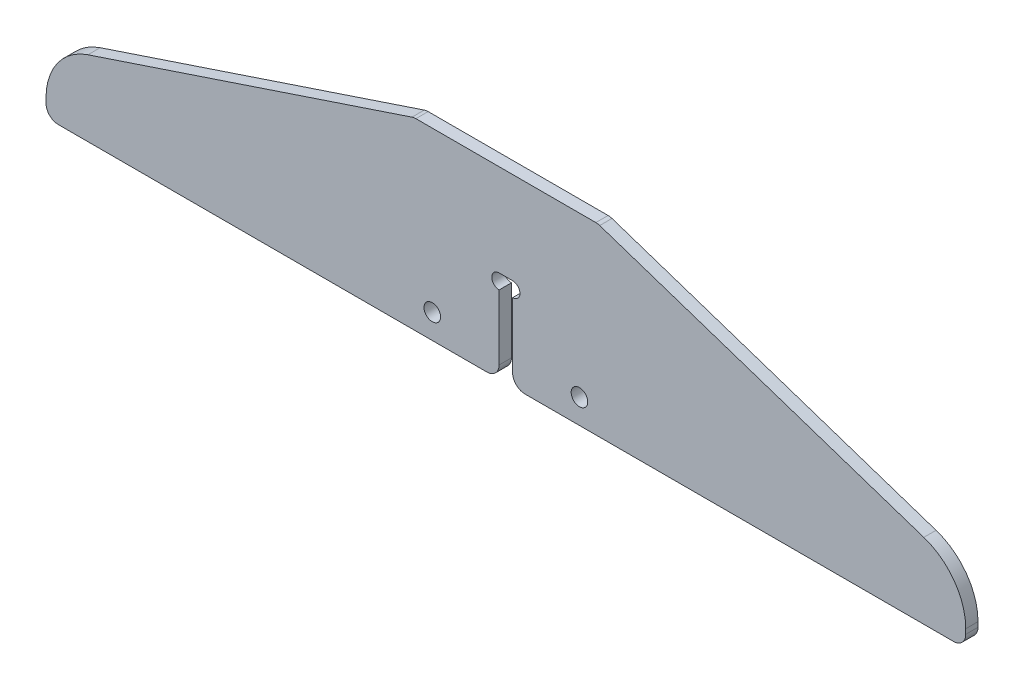
ISO-10303-21;
HEADER;
FILE_DESCRIPTION(('STEP AP214'),'2;1');
FILE_NAME('part.step','',(''),(''),'','','');
FILE_SCHEMA(('AUTOMOTIVE_DESIGN { 1 0 10303 214 1 1 1 1 }'));
ENDSEC;
DATA;
#1=APPLICATION_CONTEXT('core data for automotive mechanical design processes');
#2=APPLICATION_PROTOCOL_DEFINITION('international standard','automotive_design',2000,#1);
#3=PRODUCT_CONTEXT('',#1,'mechanical');
#4=PRODUCT('Part','Part','',(#3));
#5=PRODUCT_RELATED_PRODUCT_CATEGORY('part','',(#4));
#6=PRODUCT_DEFINITION_FORMATION('','',#4);
#7=PRODUCT_DEFINITION_CONTEXT('part definition',#1,'design');
#8=PRODUCT_DEFINITION('design','',#6,#7);
#9=PRODUCT_DEFINITION_SHAPE('','',#8);
#10=(LENGTH_UNIT() NAMED_UNIT(*) SI_UNIT(.MILLI.,.METRE.));
#11=(NAMED_UNIT(*) PLANE_ANGLE_UNIT() SI_UNIT($,.RADIAN.));
#12=(NAMED_UNIT(*) SI_UNIT($,.STERADIAN.) SOLID_ANGLE_UNIT());
#13=UNCERTAINTY_MEASURE_WITH_UNIT(LENGTH_MEASURE(1.E-05),#10,'distance_accuracy_value','');
#14=(GEOMETRIC_REPRESENTATION_CONTEXT(3) GLOBAL_UNCERTAINTY_ASSIGNED_CONTEXT((#13)) GLOBAL_UNIT_ASSIGNED_CONTEXT((#10,
#11,#12)) REPRESENTATION_CONTEXT('',''));
#15=CARTESIAN_POINT('',(0.,0.,0.));
#16=DIRECTION('',(0.,0.,1.));
#17=DIRECTION('',(1.,0.,0.));
#18=AXIS2_PLACEMENT_3D('',#15,#16,#17);
#19=CARTESIAN_POINT('',(-75.,0.,1.));
#20=DIRECTION('',(0.,1.,0.));
#21=DIRECTION('',(-1.,0.,0.));
#22=AXIS2_PLACEMENT_3D('',#19,#20,#21);
#23=PLANE('',#22);
#24=DIRECTION('',(1.,0.,0.));
#25=VECTOR('',#24,1.);
#26=CARTESIAN_POINT('',(-75.,0.,-1.));
#27=LINE('',#26,#25);
#28=CARTESIAN_POINT('',(-73.,0.,-1.));
#29=VERTEX_POINT('',#28);
#30=CARTESIAN_POINT('',(-3.10000000000001,0.,-1.));
#31=VERTEX_POINT('',#30);
#32=EDGE_CURVE('E260',#29,#31,#27,.T.);
#33=ORIENTED_EDGE('',*,*,#32,.T.);
#34=DIRECTION('',(0.,0.,1.));
#35=VECTOR('',#34,1.);
#36=CARTESIAN_POINT('',(-3.1,0.,1.));
#37=LINE('',#36,#35);
#38=CARTESIAN_POINT('',(-3.10000000000001,0.,1.));
#39=VERTEX_POINT('',#38);
#40=EDGE_CURVE('E322',#31,#39,#37,.T.);
#41=ORIENTED_EDGE('',*,*,#40,.T.);
#42=DIRECTION('',(1.,0.,0.));
#43=VECTOR('',#42,1.);
#44=CARTESIAN_POINT('',(-75.,0.,1.));
#45=LINE('',#44,#43);
#46=CARTESIAN_POINT('',(-73.,0.,1.));
#47=VERTEX_POINT('',#46);
#48=EDGE_CURVE('E245',#47,#39,#45,.T.);
#49=ORIENTED_EDGE('',*,*,#48,.F.);
#50=DIRECTION('',(0.,0.,-1.));
#51=VECTOR('',#50,1.);
#52=CARTESIAN_POINT('',(-73.,0.,1.));
#53=LINE('',#52,#51);
#54=EDGE_CURVE('E319',#47,#29,#53,.T.);
#55=ORIENTED_EDGE('',*,*,#54,.T.);
#56=EDGE_LOOP('',(#33,#41,#49,#55));
#57=FACE_BOUND('',#56,.T.);
#58=ADVANCED_FACE('F45',(#57),#23,.F.);
#59=CARTESIAN_POINT('',(-15.,30.,1.));
#60=DIRECTION('',(0.316227766016838,-0.948683298050514,0.));
#61=DIRECTION('',(0.948683298050514,0.316227766016838,0.));
#62=AXIS2_PLACEMENT_3D('',#59,#60,#61);
#63=PLANE('',#62);
#64=DIRECTION('',(-0.948683298050514,-0.316227766016838,0.));
#65=VECTOR('',#64,1.);
#66=CARTESIAN_POINT('',(-15.,30.,1.));
#67=LINE('',#66,#65);
#68=CARTESIAN_POINT('',(-15.3079002116969,29.897366596101,1.));
#69=VERTEX_POINT('',#68);
#70=CARTESIAN_POINT('',(-68.1622776601684,12.2792407799439,1.));
#71=VERTEX_POINT('',#70);
#72=EDGE_CURVE('E236',#69,#71,#67,.T.);
#73=ORIENTED_EDGE('',*,*,#72,.F.);
#74=DIRECTION('',(0.,0.,-1.));
#75=VECTOR('',#74,1.);
#76=CARTESIAN_POINT('',(-15.3079002116969,29.897366596101,1.));
#77=LINE('',#76,#75);
#78=CARTESIAN_POINT('',(-15.3079002116969,29.897366596101,-1.));
#79=VERTEX_POINT('',#78);
#80=EDGE_CURVE('E332',#69,#79,#77,.T.);
#81=ORIENTED_EDGE('',*,*,#80,.T.);
#82=DIRECTION('',(-0.948683298050514,-0.316227766016838,0.));
#83=VECTOR('',#82,1.);
#84=CARTESIAN_POINT('',(-15.,30.,-1.));
#85=LINE('',#84,#83);
#86=CARTESIAN_POINT('',(-68.1622776601684,12.2792407799439,-1.));
#87=VERTEX_POINT('',#86);
#88=EDGE_CURVE('E231',#79,#87,#85,.T.);
#89=ORIENTED_EDGE('',*,*,#88,.T.);
#90=DIRECTION('',(0.,0.,-1.));
#91=VECTOR('',#90,1.);
#92=CARTESIAN_POINT('',(-68.1622776601684,12.2792407799439,1.));
#93=LINE('',#92,#91);
#94=EDGE_CURVE('E287',#87,#71,#93,.F.);
#95=ORIENTED_EDGE('',*,*,#94,.T.);
#96=EDGE_LOOP('',(#73,#81,#89,#95));
#97=FACE_BOUND('',#96,.T.);
#98=ADVANCED_FACE('F367',(#97),#63,.F.);
#99=CARTESIAN_POINT('',(-75.,9.99999999999998,1.));
#100=DIRECTION('',(1.,0.,0.));
#101=DIRECTION('',(0.,1.,0.));
#102=AXIS2_PLACEMENT_3D('',#99,#100,#101);
#103=PLANE('',#102);
#104=DIRECTION('',(0.,-1.,0.));
#105=VECTOR('',#104,1.);
#106=CARTESIAN_POINT('',(-75.,9.99999999999998,-1.));
#107=LINE('',#106,#105);
#108=CARTESIAN_POINT('',(-75.,2.79240779943871,-1.));
#109=VERTEX_POINT('',#108);
#110=CARTESIAN_POINT('',(-75.,1.99999999999998,-1.));
#111=VERTEX_POINT('',#110);
#112=EDGE_CURVE('E256',#109,#111,#107,.T.);
#113=ORIENTED_EDGE('',*,*,#112,.T.);
#114=DIRECTION('',(0.,0.,-1.));
#115=VECTOR('',#114,1.);
#116=CARTESIAN_POINT('',(-75.,1.99999999999998,1.));
#117=LINE('',#116,#115);
#118=CARTESIAN_POINT('',(-75.,1.99999999999998,1.));
#119=VERTEX_POINT('',#118);
#120=EDGE_CURVE('E11',#111,#119,#117,.F.);
#121=ORIENTED_EDGE('',*,*,#120,.T.);
#122=DIRECTION('',(0.,-1.,0.));
#123=VECTOR('',#122,1.);
#124=CARTESIAN_POINT('',(-75.,9.99999999999998,1.));
#125=LINE('',#124,#123);
#126=CARTESIAN_POINT('',(-75.,2.79240779943871,1.));
#127=VERTEX_POINT('',#126);
#128=EDGE_CURVE('E238',#127,#119,#125,.T.);
#129=ORIENTED_EDGE('',*,*,#128,.F.);
#130=DIRECTION('',(0.,0.,-1.));
#131=VECTOR('',#130,1.);
#132=CARTESIAN_POINT('',(-75.,2.79240779943871,1.));
#133=LINE('',#132,#131);
#134=EDGE_CURVE('E284',#127,#109,#133,.T.);
#135=ORIENTED_EDGE('',*,*,#134,.T.);
#136=EDGE_LOOP('',(#113,#121,#129,#135));
#137=FACE_BOUND('',#136,.T.);
#138=ADVANCED_FACE('F376',(#137),#103,.F.);
#139=CARTESIAN_POINT('',(3.10000000000001,0.,1.));
#140=VERTEX_POINT('',#139);
#141=CARTESIAN_POINT('',(73.,0.,1.));
#142=VERTEX_POINT('',#141);
#143=EDGE_CURVE('E242',#140,#142,#45,.T.);
#144=ORIENTED_EDGE('',*,*,#143,.F.);
#145=DIRECTION('',(0.,0.,1.));
#146=VECTOR('',#145,1.);
#147=CARTESIAN_POINT('',(3.10000000000001,0.,1.));
#148=LINE('',#147,#146);
#149=CARTESIAN_POINT('',(3.10000000000001,0.,-1.));
#150=VERTEX_POINT('',#149);
#151=EDGE_CURVE('E307',#140,#150,#148,.F.);
#152=ORIENTED_EDGE('',*,*,#151,.T.);
#153=CARTESIAN_POINT('',(73.,0.,-1.));
#154=VERTEX_POINT('',#153);
#155=EDGE_CURVE('E259',#150,#154,#27,.T.);
#156=ORIENTED_EDGE('',*,*,#155,.T.);
#157=DIRECTION('',(0.,0.,-1.));
#158=VECTOR('',#157,1.);
#159=CARTESIAN_POINT('',(73.,0.,1.));
#160=LINE('',#159,#158);
#161=EDGE_CURVE('E305',#154,#142,#160,.F.);
#162=ORIENTED_EDGE('',*,*,#161,.T.);
#163=EDGE_LOOP('',(#144,#152,#156,#162));
#164=FACE_BOUND('',#163,.T.);
#165=ADVANCED_FACE('F405',(#164),#23,.F.);
#166=CARTESIAN_POINT('',(75.,10.,1.));
#167=DIRECTION('',(-1.,0.,0.));
#168=DIRECTION('',(0.,-1.,0.));
#169=AXIS2_PLACEMENT_3D('',#166,#167,#168);
#170=PLANE('',#169);
#171=DIRECTION('',(0.,1.,0.));
#172=VECTOR('',#171,1.);
#173=CARTESIAN_POINT('',(75.,10.,1.));
#174=LINE('',#173,#172);
#175=CARTESIAN_POINT('',(75.,2.,1.));
#176=VERTEX_POINT('',#175);
#177=CARTESIAN_POINT('',(75.,2.79240779943872,1.));
#178=VERTEX_POINT('',#177);
#179=EDGE_CURVE('E246',#176,#178,#174,.T.);
#180=ORIENTED_EDGE('',*,*,#179,.F.);
#181=DIRECTION('',(0.,0.,-1.));
#182=VECTOR('',#181,1.);
#183=CARTESIAN_POINT('',(75.,2.,1.));
#184=LINE('',#183,#182);
#185=CARTESIAN_POINT('',(75.,2.,-1.));
#186=VERTEX_POINT('',#185);
#187=EDGE_CURVE('E53',#176,#186,#184,.T.);
#188=ORIENTED_EDGE('',*,*,#187,.T.);
#189=DIRECTION('',(0.,1.,0.));
#190=VECTOR('',#189,1.);
#191=CARTESIAN_POINT('',(75.,10.,-1.));
#192=LINE('',#191,#190);
#193=CARTESIAN_POINT('',(75.,2.79240779943872,-1.));
#194=VERTEX_POINT('',#193);
#195=EDGE_CURVE('E263',#186,#194,#192,.T.);
#196=ORIENTED_EDGE('',*,*,#195,.T.);
#197=DIRECTION('',(0.,0.,-1.));
#198=VECTOR('',#197,1.);
#199=CARTESIAN_POINT('',(75.,2.79240779943872,1.));
#200=LINE('',#199,#198);
#201=EDGE_CURVE('E277',#194,#178,#200,.F.);
#202=ORIENTED_EDGE('',*,*,#201,.T.);
#203=EDGE_LOOP('',(#180,#188,#196,#202));
#204=FACE_BOUND('',#203,.T.);
#205=ADVANCED_FACE('F339',(#204),#170,.F.);
#206=CARTESIAN_POINT('',(15.,30.,1.));
#207=DIRECTION('',(-0.316227766016838,-0.948683298050514,0.));
#208=DIRECTION('',(0.948683298050514,-0.316227766016838,0.));
#209=AXIS2_PLACEMENT_3D('',#206,#207,#208);
#210=PLANE('',#209);
#211=DIRECTION('',(-0.948683298050514,0.316227766016838,0.));
#212=VECTOR('',#211,1.);
#213=CARTESIAN_POINT('',(15.,30.,-1.));
#214=LINE('',#213,#212);
#215=CARTESIAN_POINT('',(68.1622776601684,12.2792407799439,-1.));
#216=VERTEX_POINT('',#215);
#217=CARTESIAN_POINT('',(15.3079002116969,29.897366596101,-1.));
#218=VERTEX_POINT('',#217);
#219=EDGE_CURVE('E265',#216,#218,#214,.T.);
#220=ORIENTED_EDGE('',*,*,#219,.T.);
#221=DIRECTION('',(0.,0.,-1.));
#222=VECTOR('',#221,1.);
#223=CARTESIAN_POINT('',(15.3079002116969,29.897366596101,1.));
#224=LINE('',#223,#222);
#225=CARTESIAN_POINT('',(15.3079002116969,29.897366596101,1.));
#226=VERTEX_POINT('',#225);
#227=EDGE_CURVE('E330',#218,#226,#224,.F.);
#228=ORIENTED_EDGE('',*,*,#227,.T.);
#229=DIRECTION('',(-0.948683298050514,0.316227766016838,0.));
#230=VECTOR('',#229,1.);
#231=CARTESIAN_POINT('',(15.,30.,1.));
#232=LINE('',#231,#230);
#233=CARTESIAN_POINT('',(68.1622776601684,12.2792407799439,1.));
#234=VERTEX_POINT('',#233);
#235=EDGE_CURVE('E248',#234,#226,#232,.T.);
#236=ORIENTED_EDGE('',*,*,#235,.F.);
#237=DIRECTION('',(0.,0.,-1.));
#238=VECTOR('',#237,1.);
#239=CARTESIAN_POINT('',(68.1622776601684,12.2792407799439,1.));
#240=LINE('',#239,#238);
#241=EDGE_CURVE('E254',#234,#216,#240,.T.);
#242=ORIENTED_EDGE('',*,*,#241,.T.);
#243=EDGE_LOOP('',(#220,#228,#236,#242));
#244=FACE_BOUND('',#243,.T.);
#245=ADVANCED_FACE('F355',(#244),#210,.F.);
#246=CARTESIAN_POINT('',(15.,30.,1.));
#247=DIRECTION('',(0.,-1.,0.));
#248=DIRECTION('',(1.,0.,0.));
#249=AXIS2_PLACEMENT_3D('',#246,#247,#248);
#250=PLANE('',#249);
#251=DIRECTION('',(-1.,0.,0.));
#252=VECTOR('',#251,1.);
#253=CARTESIAN_POINT('',(15.,30.,1.));
#254=LINE('',#253,#252);
#255=CARTESIAN_POINT('',(14.6754446796632,30.,1.));
#256=VERTEX_POINT('',#255);
#257=CARTESIAN_POINT('',(-14.6754446796632,30.,1.));
#258=VERTEX_POINT('',#257);
#259=EDGE_CURVE('E251',#256,#258,#254,.T.);
#260=ORIENTED_EDGE('',*,*,#259,.F.);
#261=DIRECTION('',(0.,0.,-1.));
#262=VECTOR('',#261,1.);
#263=CARTESIAN_POINT('',(14.6754446796632,30.,1.));
#264=LINE('',#263,#262);
#265=CARTESIAN_POINT('',(14.6754446796632,30.,-1.));
#266=VERTEX_POINT('',#265);
#267=EDGE_CURVE('E328',#256,#266,#264,.T.);
#268=ORIENTED_EDGE('',*,*,#267,.T.);
#269=DIRECTION('',(-1.,0.,0.));
#270=VECTOR('',#269,1.);
#271=CARTESIAN_POINT('',(15.,30.,-1.));
#272=LINE('',#271,#270);
#273=CARTESIAN_POINT('',(-14.6754446796632,30.,-1.));
#274=VERTEX_POINT('',#273);
#275=EDGE_CURVE('E239',#266,#274,#272,.T.);
#276=ORIENTED_EDGE('',*,*,#275,.T.);
#277=DIRECTION('',(0.,0.,-1.));
#278=VECTOR('',#277,1.);
#279=CARTESIAN_POINT('',(-14.6754446796632,30.,1.));
#280=LINE('',#279,#278);
#281=EDGE_CURVE('E326',#274,#258,#280,.F.);
#282=ORIENTED_EDGE('',*,*,#281,.T.);
#283=EDGE_LOOP('',(#260,#268,#276,#282));
#284=FACE_BOUND('',#283,.T.);
#285=ADVANCED_FACE('F360',(#284),#250,.F.);
#286=CARTESIAN_POINT('',(0.,0.,1.));
#287=DIRECTION('',(0.,0.,1.));
#288=DIRECTION('',(1.,0.,0.));
#289=AXIS2_PLACEMENT_3D('',#286,#287,#288);
#290=PLANE('',#289);
#291=CARTESIAN_POINT('',(-12.,3.99999999999998,1.));
#292=DIRECTION('',(0.,0.,1.));
#293=DIRECTION('',(1.,0.,0.));
#294=AXIS2_PLACEMENT_3D('',#291,#292,#293);
#295=CIRCLE('',#294,1.35);
#296=CARTESIAN_POINT('',(-10.65,3.99999999999998,1.));
#297=VERTEX_POINT('',#296);
#298=EDGE_CURVE('E667',#297,#297,#295,.T.);
#299=ORIENTED_EDGE('',*,*,#298,.F.);
#300=EDGE_LOOP('',(#299));
#301=FACE_BOUND('',#300,.T.);
#302=CARTESIAN_POINT('',(12.,3.99999999999999,1.));
#303=DIRECTION('',(0.,0.,1.));
#304=DIRECTION('',(-1.,0.,0.));
#305=AXIS2_PLACEMENT_3D('',#302,#303,#304);
#306=CIRCLE('',#305,1.35);
#307=CARTESIAN_POINT('',(10.65,3.99999999999999,1.));
#308=VERTEX_POINT('',#307);
#309=EDGE_CURVE('E670',#308,#308,#306,.T.);
#310=ORIENTED_EDGE('',*,*,#309,.F.);
#311=EDGE_LOOP('',(#310));
#312=FACE_BOUND('',#311,.T.);
#313=DIRECTION('',(0.,1.,0.));
#314=VECTOR('',#313,1.);
#315=CARTESIAN_POINT('',(1.1,0.,1.));
#316=LINE('',#315,#314);
#317=CARTESIAN_POINT('',(1.1,1.99999999999999,1.));
#318=VERTEX_POINT('',#317);
#319=CARTESIAN_POINT('',(1.1,12.6,1.));
#320=VERTEX_POINT('',#319);
#321=EDGE_CURVE('E225',#318,#320,#316,.T.);
#322=ORIENTED_EDGE('',*,*,#321,.F.);
#323=CARTESIAN_POINT('',(3.1,1.99999999999999,1.));
#324=DIRECTION('',(0.,0.,1.));
#325=DIRECTION('',(1.,0.,0.));
#326=AXIS2_PLACEMENT_3D('',#323,#324,#325);
#327=CIRCLE('',#326,2.);
#328=EDGE_CURVE('E303',#318,#140,#327,.T.);
#329=ORIENTED_EDGE('',*,*,#328,.T.);
#330=ORIENTED_EDGE('',*,*,#143,.T.);
#331=CARTESIAN_POINT('',(73.,2.,1.));
#332=DIRECTION('',(0.,0.,1.));
#333=DIRECTION('',(1.,0.,0.));
#334=AXIS2_PLACEMENT_3D('',#331,#332,#333);
#335=CIRCLE('',#334,2.);
#336=EDGE_CURVE('E295',#142,#176,#335,.T.);
#337=ORIENTED_EDGE('',*,*,#336,.T.);
#338=ORIENTED_EDGE('',*,*,#179,.T.);
#339=CARTESIAN_POINT('',(65.,2.79240779943874,1.));
#340=DIRECTION('',(0.,0.,1.));
#341=DIRECTION('',(1.,0.,0.));
#342=AXIS2_PLACEMENT_3D('',#339,#340,#341);
#343=CIRCLE('',#342,10.);
#344=EDGE_CURVE('E282',#178,#234,#343,.T.);
#345=ORIENTED_EDGE('',*,*,#344,.T.);
#346=ORIENTED_EDGE('',*,*,#235,.T.);
#347=CARTESIAN_POINT('',(14.6754446796632,28.,1.));
#348=DIRECTION('',(0.,0.,1.));
#349=DIRECTION('',(1.,0.,0.));
#350=AXIS2_PLACEMENT_3D('',#347,#348,#349);
#351=CIRCLE('',#350,2.);
#352=EDGE_CURVE('E299',#226,#256,#351,.T.);
#353=ORIENTED_EDGE('',*,*,#352,.T.);
#354=ORIENTED_EDGE('',*,*,#259,.T.);
#355=CARTESIAN_POINT('',(-14.6754446796633,28.,1.));
#356=DIRECTION('',(0.,0.,1.));
#357=DIRECTION('',(1.,0.,0.));
#358=AXIS2_PLACEMENT_3D('',#355,#356,#357);
#359=CIRCLE('',#358,2.);
#360=EDGE_CURVE('E297',#258,#69,#359,.T.);
#361=ORIENTED_EDGE('',*,*,#360,.T.);
#362=ORIENTED_EDGE('',*,*,#72,.T.);
#363=CARTESIAN_POINT('',(-65.,2.79240779943872,1.));
#364=DIRECTION('',(0.,0.,1.));
#365=DIRECTION('',(1.,0.,0.));
#366=AXIS2_PLACEMENT_3D('',#363,#364,#365);
#367=CIRCLE('',#366,10.);
#368=EDGE_CURVE('E280',#71,#127,#367,.T.);
#369=ORIENTED_EDGE('',*,*,#368,.T.);
#370=ORIENTED_EDGE('',*,*,#128,.T.);
#371=CARTESIAN_POINT('',(-73.,1.99999999999998,1.));
#372=DIRECTION('',(0.,0.,1.));
#373=DIRECTION('',(1.,0.,0.));
#374=AXIS2_PLACEMENT_3D('',#371,#372,#373);
#375=CIRCLE('',#374,2.);
#376=EDGE_CURVE('E293',#119,#47,#375,.T.);
#377=ORIENTED_EDGE('',*,*,#376,.T.);
#378=ORIENTED_EDGE('',*,*,#48,.T.);
#379=CARTESIAN_POINT('',(-3.10000000000001,1.99999999999999,1.));
#380=DIRECTION('',(0.,0.,1.));
#381=DIRECTION('',(1.,0.,0.));
#382=AXIS2_PLACEMENT_3D('',#379,#380,#381);
#383=CIRCLE('',#382,2.);
#384=CARTESIAN_POINT('',(-1.1,1.99999999999999,1.));
#385=VERTEX_POINT('',#384);
#386=EDGE_CURVE('E301',#39,#385,#383,.T.);
#387=ORIENTED_EDGE('',*,*,#386,.T.);
#388=DIRECTION('',(0.,1.,0.));
#389=VECTOR('',#388,1.);
#390=CARTESIAN_POINT('',(-1.1,0.,1.));
#391=LINE('',#390,#389);
#392=CARTESIAN_POINT('',(-1.1,12.6,1.));
#393=VERTEX_POINT('',#392);
#394=EDGE_CURVE('E222',#385,#393,#391,.T.);
#395=ORIENTED_EDGE('',*,*,#394,.T.);
#396=CARTESIAN_POINT('',(-1.1,13.8,1.));
#397=DIRECTION('',(0.,0.,1.));
#398=DIRECTION('',(1.,0.,0.));
#399=AXIS2_PLACEMENT_3D('',#396,#397,#398);
#400=CIRCLE('',#399,1.2);
#401=CARTESIAN_POINT('',(-1.1,15.,1.));
#402=VERTEX_POINT('',#401);
#403=EDGE_CURVE('E201',#402,#393,#400,.T.);
#404=ORIENTED_EDGE('',*,*,#403,.F.);
#405=DIRECTION('',(1.,0.,0.));
#406=VECTOR('',#405,1.);
#407=CARTESIAN_POINT('',(0.,15.,1.));
#408=LINE('',#407,#406);
#409=CARTESIAN_POINT('',(1.1,15.,1.));
#410=VERTEX_POINT('',#409);
#411=EDGE_CURVE('E208',#402,#410,#408,.T.);
#412=ORIENTED_EDGE('',*,*,#411,.T.);
#413=CARTESIAN_POINT('',(1.1,13.8,1.));
#414=DIRECTION('',(0.,0.,1.));
#415=DIRECTION('',(1.,0.,0.));
#416=AXIS2_PLACEMENT_3D('',#413,#414,#415);
#417=CIRCLE('',#416,1.2);
#418=EDGE_CURVE('E211',#320,#410,#417,.T.);
#419=ORIENTED_EDGE('',*,*,#418,.F.);
#420=EDGE_LOOP('',(#322,#329,#330,#337,#338,#345,#346,#353,#354,#361,#362,#369,#370,#377,#378,
#387,#395,#404,#412,#419));
#421=FACE_BOUND('',#420,.T.);
#422=ADVANCED_FACE('F352',(#301,#312,#421),#290,.T.);
#423=CARTESIAN_POINT('',(0.,0.,-1.));
#424=DIRECTION('',(0.,0.,1.));
#425=DIRECTION('',(1.,0.,0.));
#426=AXIS2_PLACEMENT_3D('',#423,#424,#425);
#427=PLANE('',#426);
#428=CARTESIAN_POINT('',(-12.,3.99999999999998,-1.));
#429=DIRECTION('',(0.,0.,1.));
#430=DIRECTION('',(1.,0.,0.));
#431=AXIS2_PLACEMENT_3D('',#428,#429,#430);
#432=CIRCLE('',#431,1.35);
#433=CARTESIAN_POINT('',(-10.65,3.99999999999998,-1.));
#434=VERTEX_POINT('',#433);
#435=EDGE_CURVE('E223',#434,#434,#432,.T.);
#436=ORIENTED_EDGE('',*,*,#435,.T.);
#437=EDGE_LOOP('',(#436));
#438=FACE_BOUND('',#437,.T.);
#439=CARTESIAN_POINT('',(12.,3.99999999999999,-1.));
#440=DIRECTION('',(0.,0.,1.));
#441=DIRECTION('',(-1.,0.,0.));
#442=AXIS2_PLACEMENT_3D('',#439,#440,#441);
#443=CIRCLE('',#442,1.35);
#444=CARTESIAN_POINT('',(10.65,3.99999999999999,-1.));
#445=VERTEX_POINT('',#444);
#446=EDGE_CURVE('E214',#445,#445,#443,.T.);
#447=ORIENTED_EDGE('',*,*,#446,.T.);
#448=EDGE_LOOP('',(#447));
#449=FACE_BOUND('',#448,.T.);
#450=ORIENTED_EDGE('',*,*,#155,.F.);
#451=CARTESIAN_POINT('',(3.1,1.99999999999999,-1.));
#452=DIRECTION('',(0.,0.,1.));
#453=DIRECTION('',(1.,0.,0.));
#454=AXIS2_PLACEMENT_3D('',#451,#452,#453);
#455=CIRCLE('',#454,2.);
#456=CARTESIAN_POINT('',(1.1,1.99999999999999,-1.));
#457=VERTEX_POINT('',#456);
#458=EDGE_CURVE('E317',#150,#457,#455,.F.);
#459=ORIENTED_EDGE('',*,*,#458,.T.);
#460=DIRECTION('',(0.,1.,0.));
#461=VECTOR('',#460,1.);
#462=CARTESIAN_POINT('',(1.1,0.,-1.));
#463=LINE('',#462,#461);
#464=CARTESIAN_POINT('',(1.1,12.6,-1.));
#465=VERTEX_POINT('',#464);
#466=EDGE_CURVE('E193',#457,#465,#463,.T.);
#467=ORIENTED_EDGE('',*,*,#466,.T.);
#468=CARTESIAN_POINT('',(1.1,13.8,-1.));
#469=DIRECTION('',(0.,0.,1.));
#470=DIRECTION('',(1.,0.,0.));
#471=AXIS2_PLACEMENT_3D('',#468,#469,#470);
#472=CIRCLE('',#471,1.2);
#473=CARTESIAN_POINT('',(1.1,15.,-1.));
#474=VERTEX_POINT('',#473);
#475=EDGE_CURVE('E218',#465,#474,#472,.T.);
#476=ORIENTED_EDGE('',*,*,#475,.T.);
#477=DIRECTION('',(1.,0.,0.));
#478=VECTOR('',#477,1.);
#479=CARTESIAN_POINT('',(0.,15.,-1.));
#480=LINE('',#479,#478);
#481=CARTESIAN_POINT('',(-1.1,15.,-1.));
#482=VERTEX_POINT('',#481);
#483=EDGE_CURVE('E203',#482,#474,#480,.T.);
#484=ORIENTED_EDGE('',*,*,#483,.F.);
#485=CARTESIAN_POINT('',(-1.1,13.8,-1.));
#486=DIRECTION('',(0.,0.,1.));
#487=DIRECTION('',(1.,0.,0.));
#488=AXIS2_PLACEMENT_3D('',#485,#486,#487);
#489=CIRCLE('',#488,1.2);
#490=CARTESIAN_POINT('',(-1.1,12.6,-1.));
#491=VERTEX_POINT('',#490);
#492=EDGE_CURVE('E194',#482,#491,#489,.T.);
#493=ORIENTED_EDGE('',*,*,#492,.T.);
#494=DIRECTION('',(0.,1.,0.));
#495=VECTOR('',#494,1.);
#496=CARTESIAN_POINT('',(-1.1,0.,-1.));
#497=LINE('',#496,#495);
#498=CARTESIAN_POINT('',(-1.1,1.99999999999999,-1.));
#499=VERTEX_POINT('',#498);
#500=EDGE_CURVE('E183',#499,#491,#497,.T.);
#501=ORIENTED_EDGE('',*,*,#500,.F.);
#502=CARTESIAN_POINT('',(-3.10000000000001,1.99999999999999,-1.));
#503=DIRECTION('',(0.,0.,1.));
#504=DIRECTION('',(1.,0.,0.));
#505=AXIS2_PLACEMENT_3D('',#502,#503,#504);
#506=CIRCLE('',#505,2.);
#507=EDGE_CURVE('E315',#499,#31,#506,.F.);
#508=ORIENTED_EDGE('',*,*,#507,.T.);
#509=ORIENTED_EDGE('',*,*,#32,.F.);
#510=CARTESIAN_POINT('',(-73.,1.99999999999998,-1.));
#511=DIRECTION('',(0.,0.,1.));
#512=DIRECTION('',(1.,0.,0.));
#513=AXIS2_PLACEMENT_3D('',#510,#511,#512);
#514=CIRCLE('',#513,2.);
#515=EDGE_CURVE('E309',#29,#111,#514,.F.);
#516=ORIENTED_EDGE('',*,*,#515,.T.);
#517=ORIENTED_EDGE('',*,*,#112,.F.);
#518=CARTESIAN_POINT('',(-65.,2.79240779943872,-1.));
#519=DIRECTION('',(0.,0.,1.));
#520=DIRECTION('',(1.,0.,0.));
#521=AXIS2_PLACEMENT_3D('',#518,#519,#520);
#522=CIRCLE('',#521,10.);
#523=EDGE_CURVE('E271',#109,#87,#522,.F.);
#524=ORIENTED_EDGE('',*,*,#523,.T.);
#525=ORIENTED_EDGE('',*,*,#88,.F.);
#526=CARTESIAN_POINT('',(-14.6754446796633,28.,-1.));
#527=DIRECTION('',(0.,0.,1.));
#528=DIRECTION('',(1.,0.,0.));
#529=AXIS2_PLACEMENT_3D('',#526,#527,#528);
#530=CIRCLE('',#529,2.);
#531=EDGE_CURVE('E60',#79,#274,#530,.F.);
#532=ORIENTED_EDGE('',*,*,#531,.T.);
#533=ORIENTED_EDGE('',*,*,#275,.F.);
#534=CARTESIAN_POINT('',(14.6754446796632,28.,-1.));
#535=DIRECTION('',(0.,0.,1.));
#536=DIRECTION('',(1.,0.,0.));
#537=AXIS2_PLACEMENT_3D('',#534,#535,#536);
#538=CIRCLE('',#537,2.);
#539=EDGE_CURVE('E68',#266,#218,#538,.F.);
#540=ORIENTED_EDGE('',*,*,#539,.T.);
#541=ORIENTED_EDGE('',*,*,#219,.F.);
#542=CARTESIAN_POINT('',(65.,2.79240779943874,-1.));
#543=DIRECTION('',(0.,0.,1.));
#544=DIRECTION('',(1.,0.,0.));
#545=AXIS2_PLACEMENT_3D('',#542,#543,#544);
#546=CIRCLE('',#545,10.);
#547=EDGE_CURVE('E274',#216,#194,#546,.F.);
#548=ORIENTED_EDGE('',*,*,#547,.T.);
#549=ORIENTED_EDGE('',*,*,#195,.F.);
#550=CARTESIAN_POINT('',(73.,2.,-1.));
#551=DIRECTION('',(0.,0.,1.));
#552=DIRECTION('',(1.,0.,0.));
#553=AXIS2_PLACEMENT_3D('',#550,#551,#552);
#554=CIRCLE('',#553,2.);
#555=EDGE_CURVE('E311',#186,#154,#554,.F.);
#556=ORIENTED_EDGE('',*,*,#555,.T.);
#557=EDGE_LOOP('',(#450,#459,#467,#476,#484,#493,#501,#508,#509,#516,#517,#524,#525,#532,#533,
#540,#541,#548,#549,#556));
#558=FACE_BOUND('',#557,.T.);
#559=ADVANCED_FACE('F206',(#438,#449,#558),#427,.F.);
#560=CARTESIAN_POINT('',(-1.1,13.8,-1.));
#561=DIRECTION('',(0.,0.,1.));
#562=DIRECTION('',(1.,0.,0.));
#563=AXIS2_PLACEMENT_3D('',#560,#561,#562);
#564=CYLINDRICAL_SURFACE('',#563,1.2);
#565=ORIENTED_EDGE('',*,*,#403,.T.);
#566=DIRECTION('',(0.,0.,1.));
#567=VECTOR('',#566,1.);
#568=CARTESIAN_POINT('',(-1.1,12.6,-1.));
#569=LINE('',#568,#567);
#570=EDGE_CURVE('E187',#491,#393,#569,.T.);
#571=ORIENTED_EDGE('',*,*,#570,.F.);
#572=ORIENTED_EDGE('',*,*,#492,.F.);
#573=DIRECTION('',(0.,0.,1.));
#574=VECTOR('',#573,1.);
#575=CARTESIAN_POINT('',(-1.1,15.,-1.));
#576=LINE('',#575,#574);
#577=EDGE_CURVE('E229',#482,#402,#576,.T.);
#578=ORIENTED_EDGE('',*,*,#577,.T.);
#579=EDGE_LOOP('',(#565,#571,#572,#578));
#580=FACE_BOUND('',#579,.T.);
#581=ADVANCED_FACE('F198',(#580),#564,.F.);
#582=CARTESIAN_POINT('',(0.,15.,-1.));
#583=DIRECTION('',(0.,-1.,0.));
#584=DIRECTION('',(0.,0.,-1.));
#585=AXIS2_PLACEMENT_3D('',#582,#583,#584);
#586=PLANE('',#585);
#587=ORIENTED_EDGE('',*,*,#411,.F.);
#588=ORIENTED_EDGE('',*,*,#577,.F.);
#589=ORIENTED_EDGE('',*,*,#483,.T.);
#590=DIRECTION('',(0.,0.,1.));
#591=VECTOR('',#590,1.);
#592=CARTESIAN_POINT('',(1.1,15.,-1.));
#593=LINE('',#592,#591);
#594=EDGE_CURVE('E232',#474,#410,#593,.T.);
#595=ORIENTED_EDGE('',*,*,#594,.T.);
#596=EDGE_LOOP('',(#587,#588,#589,#595));
#597=FACE_BOUND('',#596,.T.);
#598=ADVANCED_FACE('F391',(#597),#586,.T.);
#599=CARTESIAN_POINT('',(1.1,13.8,-1.));
#600=DIRECTION('',(0.,0.,1.));
#601=DIRECTION('',(1.,0.,0.));
#602=AXIS2_PLACEMENT_3D('',#599,#600,#601);
#603=CYLINDRICAL_SURFACE('',#602,1.2);
#604=ORIENTED_EDGE('',*,*,#418,.T.);
#605=ORIENTED_EDGE('',*,*,#594,.F.);
#606=ORIENTED_EDGE('',*,*,#475,.F.);
#607=DIRECTION('',(0.,0.,1.));
#608=VECTOR('',#607,1.);
#609=CARTESIAN_POINT('',(1.1,12.6,-1.));
#610=LINE('',#609,#608);
#611=EDGE_CURVE('E202',#465,#320,#610,.T.);
#612=ORIENTED_EDGE('',*,*,#611,.T.);
#613=EDGE_LOOP('',(#604,#605,#606,#612));
#614=FACE_BOUND('',#613,.T.);
#615=ADVANCED_FACE('F395',(#614),#603,.F.);
#616=CARTESIAN_POINT('',(1.1,0.,-1.));
#617=DIRECTION('',(1.,0.,0.));
#618=DIRECTION('',(0.,1.,0.));
#619=AXIS2_PLACEMENT_3D('',#616,#617,#618);
#620=PLANE('',#619);
#621=ORIENTED_EDGE('',*,*,#466,.F.);
#622=DIRECTION('',(0.,0.,1.));
#623=VECTOR('',#622,1.);
#624=CARTESIAN_POINT('',(1.1,1.99999999999999,-1.));
#625=LINE('',#624,#623);
#626=EDGE_CURVE('E290',#457,#318,#625,.T.);
#627=ORIENTED_EDGE('',*,*,#626,.T.);
#628=ORIENTED_EDGE('',*,*,#321,.T.);
#629=ORIENTED_EDGE('',*,*,#611,.F.);
#630=EDGE_LOOP('',(#621,#627,#628,#629));
#631=FACE_BOUND('',#630,.T.);
#632=ADVANCED_FACE('F399',(#631),#620,.F.);
#633=CARTESIAN_POINT('',(-1.1,0.,-1.));
#634=DIRECTION('',(1.,0.,0.));
#635=DIRECTION('',(0.,1.,0.));
#636=AXIS2_PLACEMENT_3D('',#633,#634,#635);
#637=PLANE('',#636);
#638=ORIENTED_EDGE('',*,*,#394,.F.);
#639=DIRECTION('',(0.,0.,1.));
#640=VECTOR('',#639,1.);
#641=CARTESIAN_POINT('',(-1.1,1.99999999999999,-1.));
#642=LINE('',#641,#640);
#643=EDGE_CURVE('E190',#385,#499,#642,.F.);
#644=ORIENTED_EDGE('',*,*,#643,.T.);
#645=ORIENTED_EDGE('',*,*,#500,.T.);
#646=ORIENTED_EDGE('',*,*,#570,.T.);
#647=EDGE_LOOP('',(#638,#644,#645,#646));
#648=FACE_BOUND('',#647,.T.);
#649=ADVANCED_FACE('F186',(#648),#637,.T.);
#650=CARTESIAN_POINT('',(12.,3.99999999999999,-1.));
#651=DIRECTION('',(0.,0.,1.));
#652=DIRECTION('',(1.,0.,0.));
#653=AXIS2_PLACEMENT_3D('',#650,#651,#652);
#654=CYLINDRICAL_SURFACE('',#653,1.35);
#655=ORIENTED_EDGE('',*,*,#446,.F.);
#656=EDGE_LOOP('',(#655));
#657=FACE_BOUND('',#656,.T.);
#658=ORIENTED_EDGE('',*,*,#309,.T.);
#659=EDGE_LOOP('',(#658));
#660=FACE_BOUND('',#659,.T.);
#661=ADVANCED_FACE('F502',(#657,#660),#654,.F.);
#662=CARTESIAN_POINT('',(-12.,3.99999999999998,-1.));
#663=DIRECTION('',(0.,0.,1.));
#664=DIRECTION('',(1.,0.,0.));
#665=AXIS2_PLACEMENT_3D('',#662,#663,#664);
#666=CYLINDRICAL_SURFACE('',#665,1.35);
#667=ORIENTED_EDGE('',*,*,#435,.F.);
#668=EDGE_LOOP('',(#667));
#669=FACE_BOUND('',#668,.T.);
#670=ORIENTED_EDGE('',*,*,#298,.T.);
#671=EDGE_LOOP('',(#670));
#672=FACE_BOUND('',#671,.T.);
#673=ADVANCED_FACE('F434',(#669,#672),#666,.F.);
#674=CARTESIAN_POINT('',(65.,2.79240779943874,1.));
#675=DIRECTION('',(0.,0.,-1.));
#676=DIRECTION('',(-1.,0.,0.));
#677=AXIS2_PLACEMENT_3D('',#674,#675,#676);
#678=CYLINDRICAL_SURFACE('',#677,10.);
#679=ORIENTED_EDGE('',*,*,#344,.F.);
#680=ORIENTED_EDGE('',*,*,#201,.F.);
#681=ORIENTED_EDGE('',*,*,#547,.F.);
#682=ORIENTED_EDGE('',*,*,#241,.F.);
#683=EDGE_LOOP('',(#679,#680,#681,#682));
#684=FACE_BOUND('',#683,.T.);
#685=ADVANCED_FACE('F348',(#684),#678,.T.);
#686=CARTESIAN_POINT('',(-65.,2.79240779943872,1.));
#687=DIRECTION('',(0.,0.,-1.));
#688=DIRECTION('',(-1.,0.,0.));
#689=AXIS2_PLACEMENT_3D('',#686,#687,#688);
#690=CYLINDRICAL_SURFACE('',#689,10.);
#691=ORIENTED_EDGE('',*,*,#368,.F.);
#692=ORIENTED_EDGE('',*,*,#94,.F.);
#693=ORIENTED_EDGE('',*,*,#523,.F.);
#694=ORIENTED_EDGE('',*,*,#134,.F.);
#695=EDGE_LOOP('',(#691,#692,#693,#694));
#696=FACE_BOUND('',#695,.T.);
#697=ADVANCED_FACE('F372',(#696),#690,.T.);
#698=CARTESIAN_POINT('',(3.1,1.99999999999999,-1.));
#699=DIRECTION('',(0.,0.,1.));
#700=DIRECTION('',(1.,0.,0.));
#701=AXIS2_PLACEMENT_3D('',#698,#699,#700);
#702=CYLINDRICAL_SURFACE('',#701,2.);
#703=ORIENTED_EDGE('',*,*,#458,.F.);
#704=ORIENTED_EDGE('',*,*,#151,.F.);
#705=ORIENTED_EDGE('',*,*,#328,.F.);
#706=ORIENTED_EDGE('',*,*,#626,.F.);
#707=EDGE_LOOP('',(#703,#704,#705,#706));
#708=FACE_BOUND('',#707,.T.);
#709=ADVANCED_FACE('F408',(#708),#702,.T.);
#710=CARTESIAN_POINT('',(-3.10000000000001,1.99999999999999,1.));
#711=DIRECTION('',(0.,0.,-1.));
#712=DIRECTION('',(-1.,0.,0.));
#713=AXIS2_PLACEMENT_3D('',#710,#711,#712);
#714=CYLINDRICAL_SURFACE('',#713,2.);
#715=ORIENTED_EDGE('',*,*,#507,.F.);
#716=ORIENTED_EDGE('',*,*,#643,.F.);
#717=ORIENTED_EDGE('',*,*,#386,.F.);
#718=ORIENTED_EDGE('',*,*,#40,.F.);
#719=EDGE_LOOP('',(#715,#716,#717,#718));
#720=FACE_BOUND('',#719,.T.);
#721=ADVANCED_FACE('F387',(#720),#714,.T.);
#722=CARTESIAN_POINT('',(14.6754446796632,28.,1.));
#723=DIRECTION('',(0.,0.,-1.));
#724=DIRECTION('',(-1.,0.,0.));
#725=AXIS2_PLACEMENT_3D('',#722,#723,#724);
#726=CYLINDRICAL_SURFACE('',#725,2.);
#727=ORIENTED_EDGE('',*,*,#352,.F.);
#728=ORIENTED_EDGE('',*,*,#227,.F.);
#729=ORIENTED_EDGE('',*,*,#539,.F.);
#730=ORIENTED_EDGE('',*,*,#267,.F.);
#731=EDGE_LOOP('',(#727,#728,#729,#730));
#732=FACE_BOUND('',#731,.T.);
#733=ADVANCED_FACE('F356',(#732),#726,.T.);
#734=CARTESIAN_POINT('',(-14.6754446796633,28.,1.));
#735=DIRECTION('',(0.,0.,-1.));
#736=DIRECTION('',(-1.,0.,0.));
#737=AXIS2_PLACEMENT_3D('',#734,#735,#736);
#738=CYLINDRICAL_SURFACE('',#737,2.);
#739=ORIENTED_EDGE('',*,*,#360,.F.);
#740=ORIENTED_EDGE('',*,*,#281,.F.);
#741=ORIENTED_EDGE('',*,*,#531,.F.);
#742=ORIENTED_EDGE('',*,*,#80,.F.);
#743=EDGE_LOOP('',(#739,#740,#741,#742));
#744=FACE_BOUND('',#743,.T.);
#745=ADVANCED_FACE('F363',(#744),#738,.T.);
#746=CARTESIAN_POINT('',(73.,2.,1.));
#747=DIRECTION('',(0.,0.,-1.));
#748=DIRECTION('',(-1.,0.,0.));
#749=AXIS2_PLACEMENT_3D('',#746,#747,#748);
#750=CYLINDRICAL_SURFACE('',#749,2.);
#751=ORIENTED_EDGE('',*,*,#336,.F.);
#752=ORIENTED_EDGE('',*,*,#161,.F.);
#753=ORIENTED_EDGE('',*,*,#555,.F.);
#754=ORIENTED_EDGE('',*,*,#187,.F.);
#755=EDGE_LOOP('',(#751,#752,#753,#754));
#756=FACE_BOUND('',#755,.T.);
#757=ADVANCED_FACE('F409',(#756),#750,.T.);
#758=CARTESIAN_POINT('',(-73.,1.99999999999998,1.));
#759=DIRECTION('',(0.,0.,-1.));
#760=DIRECTION('',(-1.,0.,0.));
#761=AXIS2_PLACEMENT_3D('',#758,#759,#760);
#762=CYLINDRICAL_SURFACE('',#761,2.);
#763=ORIENTED_EDGE('',*,*,#376,.F.);
#764=ORIENTED_EDGE('',*,*,#120,.F.);
#765=ORIENTED_EDGE('',*,*,#515,.F.);
#766=ORIENTED_EDGE('',*,*,#54,.F.);
#767=EDGE_LOOP('',(#763,#764,#765,#766));
#768=FACE_BOUND('',#767,.T.);
#769=ADVANCED_FACE('F47',(#768),#762,.T.);
#770=CLOSED_SHELL('',(#58,#98,#138,#165,#205,#245,#285,#422,#559,#581,#598,#615,#632,#649,#661,
#673,#685,#697,#709,#721,#733,#745,#757,#769));
#771=MANIFOLD_SOLID_BREP('B2',#770);
#772=ADVANCED_BREP_SHAPE_REPRESENTATION('',(#18,#771),#14);
#773=SHAPE_DEFINITION_REPRESENTATION(#9,#772);
ENDSEC;
END-ISO-10303-21;
